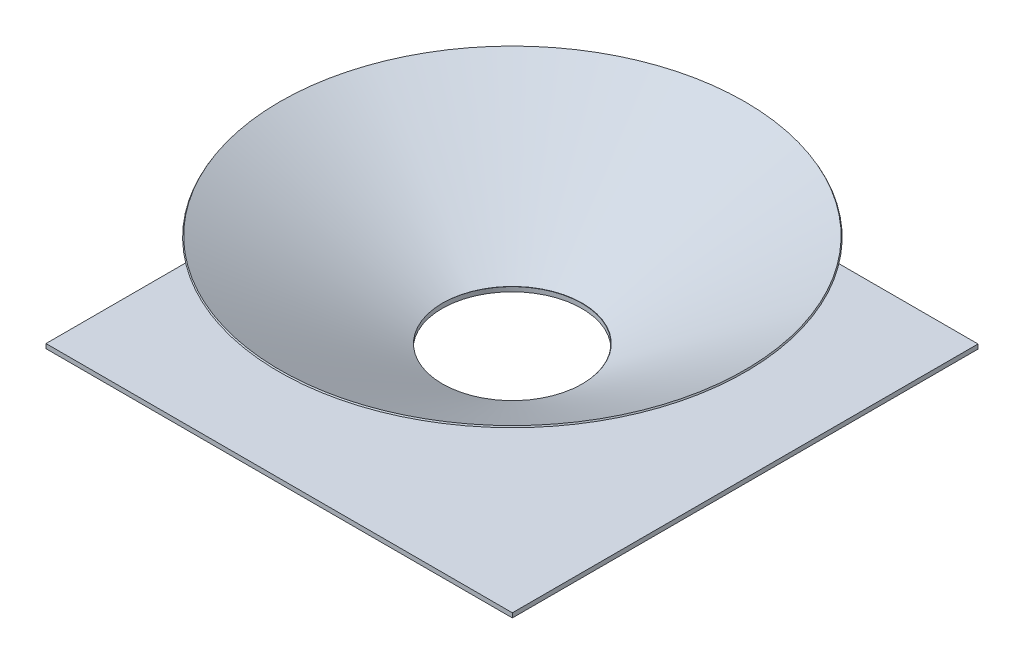
ISO-10303-21;
HEADER;
FILE_DESCRIPTION(('STEP AP214'),'2;1');
FILE_NAME('part.step','',(''),(''),'','','');
FILE_SCHEMA(('AUTOMOTIVE_DESIGN { 1 0 10303 214 1 1 1 1 }'));
ENDSEC;
DATA;
#1=APPLICATION_CONTEXT('core data for automotive mechanical design processes');
#2=APPLICATION_PROTOCOL_DEFINITION('international standard','automotive_design',2000,#1);
#3=PRODUCT_CONTEXT('',#1,'mechanical');
#4=PRODUCT('Part','Part','',(#3));
#5=PRODUCT_RELATED_PRODUCT_CATEGORY('part','',(#4));
#6=PRODUCT_DEFINITION_FORMATION('','',#4);
#7=PRODUCT_DEFINITION_CONTEXT('part definition',#1,'design');
#8=PRODUCT_DEFINITION('design','',#6,#7);
#9=PRODUCT_DEFINITION_SHAPE('','',#8);
#10=(LENGTH_UNIT() NAMED_UNIT(*) SI_UNIT(.MILLI.,.METRE.));
#11=(NAMED_UNIT(*) PLANE_ANGLE_UNIT() SI_UNIT($,.RADIAN.));
#12=(NAMED_UNIT(*) SI_UNIT($,.STERADIAN.) SOLID_ANGLE_UNIT());
#13=UNCERTAINTY_MEASURE_WITH_UNIT(LENGTH_MEASURE(1.E-05),#10,'distance_accuracy_value','');
#14=(GEOMETRIC_REPRESENTATION_CONTEXT(3) GLOBAL_UNCERTAINTY_ASSIGNED_CONTEXT((#13)) GLOBAL_UNIT_ASSIGNED_CONTEXT((#10,
#11,#12)) REPRESENTATION_CONTEXT('',''));
#15=CARTESIAN_POINT('',(0.,0.,0.));
#16=DIRECTION('',(0.,0.,1.));
#17=DIRECTION('',(1.,0.,0.));
#18=AXIS2_PLACEMENT_3D('',#15,#16,#17);
#19=CARTESIAN_POINT('',(-48.8836522994883,0.,0.));
#20=DIRECTION('',(0.,1.,0.));
#21=DIRECTION('',(0.,0.,1.));
#22=AXIS2_PLACEMENT_3D('',#19,#20,#21);
#23=PLANE('',#22);
#24=CARTESIAN_POINT('',(0.,0.,0.24892312130248));
#25=DIRECTION('',(0.,1.,0.));
#26=DIRECTION('',(0.,0.,1.));
#27=AXIS2_PLACEMENT_3D('',#24,#25,#26);
#28=CIRCLE('',#27,46.875);
#29=CARTESIAN_POINT('',(-46.8748347657879,0.,0.12446156066631));
#30=VERTEX_POINT('',#29);
#31=CARTESIAN_POINT('',(46.874834765788,0.,0.12446156063556));
#32=VERTEX_POINT('',#31);
#33=EDGE_CURVE('E144',#30,#32,#28,.T.);
#34=ORIENTED_EDGE('',*,*,#33,.F.);
#35=CARTESIAN_POINT('',(0.,0.,0.));
#36=DIRECTION('',(0.,-1.,0.));
#37=DIRECTION('',(0.,0.,-1.));
#38=AXIS2_PLACEMENT_3D('',#35,#36,#37);
#39=CIRCLE('',#38,46.875);
#40=EDGE_CURVE('E11',#32,#30,#39,.T.);
#41=ORIENTED_EDGE('',*,*,#40,.F.);
#42=EDGE_LOOP('',(#34,#41));
#43=FACE_BOUND('',#42,.T.);
#44=ADVANCED_FACE('F35',(#43),#23,.F.);
#45=CARTESIAN_POINT('',(0.,0.,0.));
#46=DIRECTION('',(0.,1.,0.));
#47=DIRECTION('',(0.,0.,1.));
#48=AXIS2_PLACEMENT_3D('',#45,#46,#47);
#49=CONICAL_SURFACE('',#48,46.875,1.04968271570928);
#50=CARTESIAN_POINT('',(0.,62.5,0.));
#51=DIRECTION('',(0.,-1.,0.));
#52=DIRECTION('',(0.,0.,-1.));
#53=AXIS2_PLACEMENT_3D('',#50,#51,#52);
#54=CIRCLE('',#53,155.752153757395);
#55=CARTESIAN_POINT('',(0.,62.5,-155.752153757395));
#56=VERTEX_POINT('',#55);
#57=EDGE_CURVE('E42',#56,#56,#54,.T.);
#58=ORIENTED_EDGE('',*,*,#57,.F.);
#59=EDGE_LOOP('',(#58));
#60=FACE_BOUND('',#59,.T.);
#61=ORIENTED_EDGE('',*,*,#40,.T.);
#62=CARTESIAN_POINT('',(0.,0.,0.));
#63=DIRECTION('',(0.,-1.,0.));
#64=DIRECTION('',(0.,0.,-1.));
#65=AXIS2_PLACEMENT_3D('',#62,#63,#64);
#66=CIRCLE('',#65,46.875);
#67=EDGE_CURVE('E52',#32,#30,#66,.F.);
#68=ORIENTED_EDGE('',*,*,#67,.F.);
#69=EDGE_LOOP('',(#61,#68));
#70=FACE_BOUND('',#69,.T.);
#71=ADVANCED_FACE('F138',(#60,#70),#49,.F.);
#72=CARTESIAN_POINT('',(0.,62.5,0.));
#73=DIRECTION('',(0.,-1.,0.));
#74=DIRECTION('',(0.,0.,-1.));
#75=AXIS2_PLACEMENT_3D('',#72,#73,#74);
#76=CONICAL_SURFACE('',#75,155.752153757395,0.521113611085622);
#77=CARTESIAN_POINT('',(0.,61.6327346895418,0.));
#78=DIRECTION('',(0.,-1.,0.));
#79=DIRECTION('',(0.,0.,-1.));
#80=AXIS2_PLACEMENT_3D('',#77,#78,#79);
#81=CIRCLE('',#80,156.25);
#82=CARTESIAN_POINT('',(0.,61.6327346895418,-156.25));
#83=VERTEX_POINT('',#82);
#84=EDGE_CURVE('E131',#83,#83,#81,.T.);
#85=ORIENTED_EDGE('',*,*,#84,.F.);
#86=EDGE_LOOP('',(#85));
#87=FACE_BOUND('',#86,.T.);
#88=ORIENTED_EDGE('',*,*,#57,.T.);
#89=EDGE_LOOP('',(#88));
#90=FACE_BOUND('',#89,.T.);
#91=ADVANCED_FACE('F136',(#87,#90),#76,.T.);
#92=CARTESIAN_POINT('',(0.,61.6327346895418,0.));
#93=DIRECTION('',(0.,1.,0.));
#94=DIRECTION('',(0.,0.,1.));
#95=AXIS2_PLACEMENT_3D('',#92,#93,#94);
#96=CONICAL_SURFACE('',#95,156.25,1.04968271570928);
#97=CARTESIAN_POINT('',(0.,9.73610064724726,0.));
#98=DIRECTION('',(0.,-1.,0.));
#99=DIRECTION('',(0.,0.,-1.));
#100=AXIS2_PLACEMENT_3D('',#97,#98,#99);
#101=CIRCLE('',#100,65.8442751341733);
#102=CARTESIAN_POINT('',(0.,9.73610064724726,-65.8442751341733));
#103=VERTEX_POINT('',#102);
#104=EDGE_CURVE('E128',#103,#103,#101,.T.);
#105=ORIENTED_EDGE('',*,*,#104,.F.);
#106=EDGE_LOOP('',(#105));
#107=FACE_BOUND('',#106,.T.);
#108=ORIENTED_EDGE('',*,*,#84,.T.);
#109=EDGE_LOOP('',(#108));
#110=FACE_BOUND('',#109,.T.);
#111=ADVANCED_FACE('F175',(#107,#110),#96,.T.);
#112=CARTESIAN_POINT('',(0.,5.21409603269401,0.));
#113=DIRECTION('',(0.,-1.,0.));
#114=DIRECTION('',(0.,0.,-1.));
#115=AXIS2_PLACEMENT_3D('',#112,#113,#114);
#116=TOROIDAL_SURFACE('',#115,68.4400932526313,5.21409603269401);
#117=CARTESIAN_POINT('',(0.,0.,0.));
#118=DIRECTION('',(0.,-1.,0.));
#119=DIRECTION('',(0.,0.,-1.));
#120=AXIS2_PLACEMENT_3D('',#117,#118,#119);
#121=CIRCLE('',#120,68.4400932526313);
#122=CARTESIAN_POINT('',(0.,0.,-68.4400932526313));
#123=VERTEX_POINT('',#122);
#124=EDGE_CURVE('E125',#123,#123,#121,.T.);
#125=ORIENTED_EDGE('',*,*,#124,.F.);
#126=EDGE_LOOP('',(#125));
#127=FACE_BOUND('',#126,.T.);
#128=ORIENTED_EDGE('',*,*,#104,.T.);
#129=EDGE_LOOP('',(#128));
#130=FACE_BOUND('',#129,.T.);
#131=ADVANCED_FACE('F182',(#127,#130),#116,.F.);
#132=CARTESIAN_POINT('',(0.,0.,0.));
#133=DIRECTION('',(0.,-1.,0.));
#134=DIRECTION('',(0.,0.,-1.));
#135=AXIS2_PLACEMENT_3D('',#132,#133,#134);
#136=PLANE('',#135);
#137=EDGE_CURVE('E48',#32,#30,#28,.T.);
#138=ORIENTED_EDGE('',*,*,#137,.F.);
#139=ORIENTED_EDGE('',*,*,#67,.T.);
#140=EDGE_LOOP('',(#138,#139));
#141=FACE_BOUND('',#140,.T.);
#142=ADVANCED_FACE('F159',(#141),#136,.F.);
#143=CARTESIAN_POINT('',(-156.25,-3.,156.25));
#144=DIRECTION('',(-1.,0.,0.));
#145=DIRECTION('',(0.,0.,1.));
#146=AXIS2_PLACEMENT_3D('',#143,#144,#145);
#147=PLANE('',#146);
#148=DIRECTION('',(0.,0.,1.));
#149=VECTOR('',#148,1.);
#150=CARTESIAN_POINT('',(-156.25,0.,156.25));
#151=LINE('',#150,#149);
#152=CARTESIAN_POINT('',(-156.25,0.,-155.752153757395));
#153=VERTEX_POINT('',#152);
#154=CARTESIAN_POINT('',(-156.25,0.,156.25));
#155=VERTEX_POINT('',#154);
#156=EDGE_CURVE('E114',#153,#155,#151,.T.);
#157=ORIENTED_EDGE('',*,*,#156,.F.);
#158=DIRECTION('',(0.,1.,0.));
#159=VECTOR('',#158,1.);
#160=CARTESIAN_POINT('',(-156.25,-3.,-155.752153757395));
#161=LINE('',#160,#159);
#162=CARTESIAN_POINT('',(-156.25,-3.,-155.752153757395));
#163=VERTEX_POINT('',#162);
#164=EDGE_CURVE('E103',#163,#153,#161,.T.);
#165=ORIENTED_EDGE('',*,*,#164,.F.);
#166=DIRECTION('',(0.,0.,1.));
#167=VECTOR('',#166,1.);
#168=CARTESIAN_POINT('',(-156.25,-3.,156.25));
#169=LINE('',#168,#167);
#170=CARTESIAN_POINT('',(-156.25,-3.,156.25));
#171=VERTEX_POINT('',#170);
#172=EDGE_CURVE('E97',#163,#171,#169,.T.);
#173=ORIENTED_EDGE('',*,*,#172,.T.);
#174=DIRECTION('',(0.,1.,0.));
#175=VECTOR('',#174,1.);
#176=CARTESIAN_POINT('',(-156.25,-3.,156.25));
#177=LINE('',#176,#175);
#178=EDGE_CURVE('E79',#171,#155,#177,.T.);
#179=ORIENTED_EDGE('',*,*,#178,.T.);
#180=EDGE_LOOP('',(#157,#165,#173,#179));
#181=FACE_BOUND('',#180,.T.);
#182=ADVANCED_FACE('F102',(#181),#147,.T.);
#183=CARTESIAN_POINT('',(-156.25,-3.,-155.752153757395));
#184=DIRECTION('',(0.,0.,-1.));
#185=DIRECTION('',(-1.,0.,0.));
#186=AXIS2_PLACEMENT_3D('',#183,#184,#185);
#187=PLANE('',#186);
#188=DIRECTION('',(-1.,0.,0.));
#189=VECTOR('',#188,1.);
#190=CARTESIAN_POINT('',(-156.25,0.,-155.752153757395));
#191=LINE('',#190,#189);
#192=CARTESIAN_POINT('',(156.25,0.,-155.752153757395));
#193=VERTEX_POINT('',#192);
#194=EDGE_CURVE('E104',#193,#153,#191,.T.);
#195=ORIENTED_EDGE('',*,*,#194,.F.);
#196=DIRECTION('',(0.,1.,0.));
#197=VECTOR('',#196,1.);
#198=CARTESIAN_POINT('',(156.25,-3.,-155.752153757395));
#199=LINE('',#198,#197);
#200=CARTESIAN_POINT('',(156.25,-3.,-155.752153757395));
#201=VERTEX_POINT('',#200);
#202=EDGE_CURVE('E121',#201,#193,#199,.T.);
#203=ORIENTED_EDGE('',*,*,#202,.F.);
#204=DIRECTION('',(-1.,0.,0.));
#205=VECTOR('',#204,1.);
#206=CARTESIAN_POINT('',(-156.25,-3.,-155.752153757395));
#207=LINE('',#206,#205);
#208=EDGE_CURVE('E90',#201,#163,#207,.T.);
#209=ORIENTED_EDGE('',*,*,#208,.T.);
#210=ORIENTED_EDGE('',*,*,#164,.T.);
#211=EDGE_LOOP('',(#195,#203,#209,#210));
#212=FACE_BOUND('',#211,.T.);
#213=ADVANCED_FACE('F202',(#212),#187,.T.);
#214=CARTESIAN_POINT('',(156.25,-3.,156.25));
#215=DIRECTION('',(1.,0.,0.));
#216=DIRECTION('',(0.,0.,-1.));
#217=AXIS2_PLACEMENT_3D('',#214,#215,#216);
#218=PLANE('',#217);
#219=DIRECTION('',(0.,0.,-1.));
#220=VECTOR('',#219,1.);
#221=CARTESIAN_POINT('',(156.25,0.,156.25));
#222=LINE('',#221,#220);
#223=CARTESIAN_POINT('',(156.25,0.,156.25));
#224=VERTEX_POINT('',#223);
#225=EDGE_CURVE('E107',#224,#193,#222,.T.);
#226=ORIENTED_EDGE('',*,*,#225,.F.);
#227=DIRECTION('',(0.,1.,0.));
#228=VECTOR('',#227,1.);
#229=CARTESIAN_POINT('',(156.25,-3.,156.25));
#230=LINE('',#229,#228);
#231=CARTESIAN_POINT('',(156.25,-3.,156.25));
#232=VERTEX_POINT('',#231);
#233=EDGE_CURVE('E89',#232,#224,#230,.T.);
#234=ORIENTED_EDGE('',*,*,#233,.F.);
#235=DIRECTION('',(0.,0.,-1.));
#236=VECTOR('',#235,1.);
#237=CARTESIAN_POINT('',(156.25,-3.,156.25));
#238=LINE('',#237,#236);
#239=EDGE_CURVE('E100',#232,#201,#238,.T.);
#240=ORIENTED_EDGE('',*,*,#239,.T.);
#241=ORIENTED_EDGE('',*,*,#202,.T.);
#242=EDGE_LOOP('',(#226,#234,#240,#241));
#243=FACE_BOUND('',#242,.T.);
#244=ADVANCED_FACE('F209',(#243),#218,.T.);
#245=CARTESIAN_POINT('',(-156.25,-3.,156.25));
#246=DIRECTION('',(0.,0.,1.));
#247=DIRECTION('',(1.,0.,0.));
#248=AXIS2_PLACEMENT_3D('',#245,#246,#247);
#249=PLANE('',#248);
#250=DIRECTION('',(1.,0.,0.));
#251=VECTOR('',#250,1.);
#252=CARTESIAN_POINT('',(-156.25,0.,156.25));
#253=LINE('',#252,#251);
#254=EDGE_CURVE('E84',#155,#224,#253,.T.);
#255=ORIENTED_EDGE('',*,*,#254,.F.);
#256=ORIENTED_EDGE('',*,*,#178,.F.);
#257=DIRECTION('',(1.,0.,0.));
#258=VECTOR('',#257,1.);
#259=CARTESIAN_POINT('',(-156.25,-3.,156.25));
#260=LINE('',#259,#258);
#261=EDGE_CURVE('E82',#171,#232,#260,.T.);
#262=ORIENTED_EDGE('',*,*,#261,.T.);
#263=ORIENTED_EDGE('',*,*,#233,.T.);
#264=EDGE_LOOP('',(#255,#256,#262,#263));
#265=FACE_BOUND('',#264,.T.);
#266=ADVANCED_FACE('F81',(#265),#249,.T.);
#267=CARTESIAN_POINT('',(0.,-3.,0.));
#268=DIRECTION('',(0.,-1.,0.));
#269=DIRECTION('',(0.,0.,-1.));
#270=AXIS2_PLACEMENT_3D('',#267,#268,#269);
#271=PLANE('',#270);
#272=CARTESIAN_POINT('',(0.,-3.,0.24892312130248));
#273=DIRECTION('',(0.,1.,0.));
#274=DIRECTION('',(0.,0.,1.));
#275=AXIS2_PLACEMENT_3D('',#272,#273,#274);
#276=CIRCLE('',#275,46.875);
#277=CARTESIAN_POINT('',(0.,-3.,47.1239231213025));
#278=VERTEX_POINT('',#277);
#279=EDGE_CURVE('E116',#278,#278,#276,.T.);
#280=ORIENTED_EDGE('',*,*,#279,.T.);
#281=EDGE_LOOP('',(#280));
#282=FACE_BOUND('',#281,.T.);
#283=ORIENTED_EDGE('',*,*,#172,.F.);
#284=ORIENTED_EDGE('',*,*,#208,.F.);
#285=ORIENTED_EDGE('',*,*,#239,.F.);
#286=ORIENTED_EDGE('',*,*,#261,.F.);
#287=EDGE_LOOP('',(#283,#284,#285,#286));
#288=FACE_BOUND('',#287,.T.);
#289=ADVANCED_FACE('F95',(#282,#288),#271,.T.);
#290=ORIENTED_EDGE('',*,*,#124,.T.);
#291=EDGE_LOOP('',(#290));
#292=FACE_BOUND('',#291,.T.);
#293=ORIENTED_EDGE('',*,*,#156,.T.);
#294=ORIENTED_EDGE('',*,*,#254,.T.);
#295=ORIENTED_EDGE('',*,*,#225,.T.);
#296=ORIENTED_EDGE('',*,*,#194,.T.);
#297=EDGE_LOOP('',(#293,#294,#295,#296));
#298=FACE_BOUND('',#297,.T.);
#299=ADVANCED_FACE('F152',(#292,#298),#136,.F.);
#300=CARTESIAN_POINT('',(0.,-3.,0.24892312130248));
#301=DIRECTION('',(0.,1.,0.));
#302=DIRECTION('',(0.,0.,1.));
#303=AXIS2_PLACEMENT_3D('',#300,#301,#302);
#304=CYLINDRICAL_SURFACE('',#303,46.875);
#305=ORIENTED_EDGE('',*,*,#279,.F.);
#306=EDGE_LOOP('',(#305));
#307=FACE_BOUND('',#306,.T.);
#308=ORIENTED_EDGE('',*,*,#137,.T.);
#309=ORIENTED_EDGE('',*,*,#33,.T.);
#310=EDGE_LOOP('',(#308,#309));
#311=FACE_BOUND('',#310,.T.);
#312=ADVANCED_FACE('F150',(#307,#311),#304,.F.);
#313=CLOSED_SHELL('',(#44,#71,#91,#111,#131,#142,#182,#213,#244,#266,#289,#299,#312));
#314=MANIFOLD_SOLID_BREP('B2',#313);
#315=ADVANCED_BREP_SHAPE_REPRESENTATION('',(#18,#314),#14);
#316=SHAPE_DEFINITION_REPRESENTATION(#9,#315);
ENDSEC;
END-ISO-10303-21;
